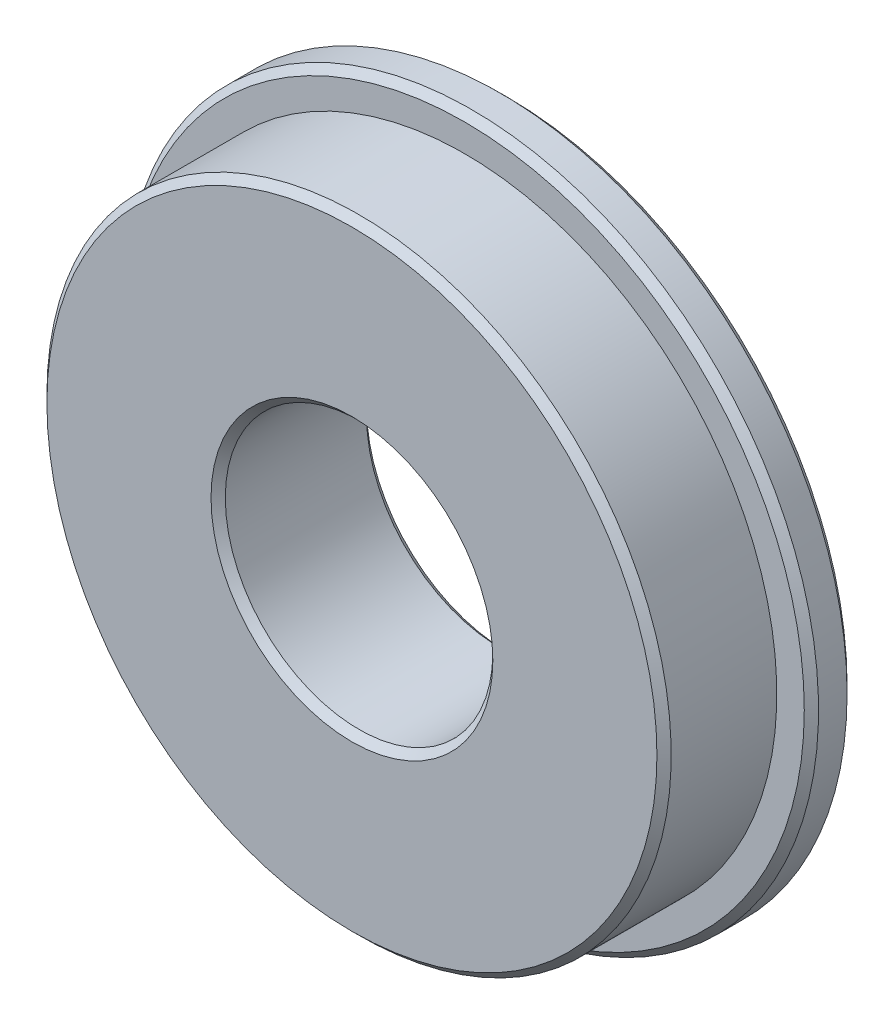
ISO-10303-21;
HEADER;
FILE_DESCRIPTION(('STEP AP214'),'2;1');
FILE_NAME('part.step','',(''),(''),'','','');
FILE_SCHEMA(('AUTOMOTIVE_DESIGN { 1 0 10303 214 1 1 1 1 }'));
ENDSEC;
DATA;
#1=APPLICATION_CONTEXT('core data for automotive mechanical design processes');
#2=APPLICATION_PROTOCOL_DEFINITION('international standard','automotive_design',2000,#1);
#3=PRODUCT_CONTEXT('',#1,'mechanical');
#4=PRODUCT('Part','Part','',(#3));
#5=PRODUCT_RELATED_PRODUCT_CATEGORY('part','',(#4));
#6=PRODUCT_DEFINITION_FORMATION('','',#4);
#7=PRODUCT_DEFINITION_CONTEXT('part definition',#1,'design');
#8=PRODUCT_DEFINITION('design','',#6,#7);
#9=PRODUCT_DEFINITION_SHAPE('','',#8);
#10=(LENGTH_UNIT() NAMED_UNIT(*) SI_UNIT(.MILLI.,.METRE.));
#11=(NAMED_UNIT(*) PLANE_ANGLE_UNIT() SI_UNIT($,.RADIAN.));
#12=(NAMED_UNIT(*) SI_UNIT($,.STERADIAN.) SOLID_ANGLE_UNIT());
#13=UNCERTAINTY_MEASURE_WITH_UNIT(LENGTH_MEASURE(1.E-05),#10,'distance_accuracy_value','');
#14=(GEOMETRIC_REPRESENTATION_CONTEXT(3) GLOBAL_UNCERTAINTY_ASSIGNED_CONTEXT((#13)) GLOBAL_UNIT_ASSIGNED_CONTEXT((#10,
#11,#12)) REPRESENTATION_CONTEXT('',''));
#15=CARTESIAN_POINT('',(0.,0.,0.));
#16=DIRECTION('',(0.,0.,1.));
#17=DIRECTION('',(1.,0.,0.));
#18=AXIS2_PLACEMENT_3D('',#15,#16,#17);
#19=CARTESIAN_POINT('',(-8.86153846153846,6.04195804195805,5.28319999999998));
#20=DIRECTION('',(0.,0.,-1.));
#21=DIRECTION('',(-1.,0.,0.));
#22=AXIS2_PLACEMENT_3D('',#19,#20,#21);
#23=CONICAL_SURFACE('',#22,11.1125,0.78539816339745);
#24=CARTESIAN_POINT('',(-8.86153846153846,6.04195804195805,5.2832));
#25=DIRECTION('',(0.,0.,-1.));
#26=DIRECTION('',(-1.,0.,0.));
#27=AXIS2_PLACEMENT_3D('',#24,#25,#26);
#28=CIRCLE('',#27,11.1125);
#29=CARTESIAN_POINT('',(-19.9740384615385,6.04195804195805,5.2832));
#30=VERTEX_POINT('',#29);
#31=EDGE_CURVE('E44',#30,#30,#28,.T.);
#32=ORIENTED_EDGE('',*,*,#31,.F.);
#33=EDGE_LOOP('',(#32));
#34=FACE_BOUND('',#33,.T.);
#35=CARTESIAN_POINT('',(-8.86153846153846,6.04195804195805,5.53719999999998));
#36=DIRECTION('',(0.,0.,-1.));
#37=DIRECTION('',(-1.,0.,0.));
#38=AXIS2_PLACEMENT_3D('',#35,#36,#37);
#39=CIRCLE('',#38,10.8585);
#40=CARTESIAN_POINT('',(-19.7200384615385,6.04195804195805,5.53719999999998));
#41=VERTEX_POINT('',#40);
#42=EDGE_CURVE('E18',#41,#41,#39,.T.);
#43=ORIENTED_EDGE('',*,*,#42,.T.);
#44=EDGE_LOOP('',(#43));
#45=FACE_BOUND('',#44,.T.);
#46=ADVANCED_FACE('F15',(#34,#45),#23,.T.);
#47=CARTESIAN_POINT('',(-8.86153846153846,6.04195804195805,5.5372));
#48=DIRECTION('',(0.,0.,-1.));
#49=DIRECTION('',(-1.,0.,0.));
#50=AXIS2_PLACEMENT_3D('',#47,#48,#49);
#51=CYLINDRICAL_SURFACE('',#50,11.1125);
#52=CARTESIAN_POINT('',(-8.86153846153846,6.04195804195805,1.524));
#53=DIRECTION('',(0.,0.,-1.));
#54=DIRECTION('',(-1.,0.,0.));
#55=AXIS2_PLACEMENT_3D('',#52,#53,#54);
#56=CIRCLE('',#55,11.1125);
#57=CARTESIAN_POINT('',(-19.9740384615385,6.04195804195805,1.524));
#58=VERTEX_POINT('',#57);
#59=EDGE_CURVE('E39',#58,#58,#56,.F.);
#60=ORIENTED_EDGE('',*,*,#59,.T.);
#61=EDGE_LOOP('',(#60));
#62=FACE_BOUND('',#61,.T.);
#63=ORIENTED_EDGE('',*,*,#31,.T.);
#64=EDGE_LOOP('',(#63));
#65=FACE_BOUND('',#64,.T.);
#66=ADVANCED_FACE('F159',(#62,#65),#51,.T.);
#67=CARTESIAN_POINT('',(-8.86153846153846,6.04195804195805,5.5372));
#68=DIRECTION('',(0.,0.,-1.));
#69=DIRECTION('',(-1.,0.,0.));
#70=AXIS2_PLACEMENT_3D('',#67,#68,#69);
#71=PLANE('',#70);
#72=ORIENTED_EDGE('',*,*,#42,.F.);
#73=EDGE_LOOP('',(#72));
#74=FACE_BOUND('',#73,.T.);
#75=CARTESIAN_POINT('',(-8.86153846153846,6.04195804195805,5.53719999993518));
#76=DIRECTION('',(0.,0.,1.));
#77=DIRECTION('',(1.,0.,0.));
#78=AXIS2_PLACEMENT_3D('',#75,#76,#77);
#79=CIRCLE('',#78,5.01650000001817);
#80=CARTESIAN_POINT('',(-3.84503846152029,6.04195804195805,5.53719999993518));
#81=VERTEX_POINT('',#80);
#82=EDGE_CURVE('E37',#81,#81,#79,.F.);
#83=ORIENTED_EDGE('',*,*,#82,.T.);
#84=EDGE_LOOP('',(#83));
#85=FACE_BOUND('',#84,.T.);
#86=ADVANCED_FACE('F149',(#74,#85),#71,.F.);
#87=CARTESIAN_POINT('',(-8.86153846153846,6.04195804195805,1.524));
#88=DIRECTION('',(0.,0.,-1.));
#89=DIRECTION('',(-1.,0.,0.));
#90=AXIS2_PLACEMENT_3D('',#87,#88,#89);
#91=PLANE('',#90);
#92=ORIENTED_EDGE('',*,*,#59,.F.);
#93=EDGE_LOOP('',(#92));
#94=FACE_BOUND('',#93,.T.);
#95=CARTESIAN_POINT('',(-8.86153846153846,6.04195804195805,1.52399999999998));
#96=DIRECTION('',(0.,0.,-1.));
#97=DIRECTION('',(-1.,0.,0.));
#98=AXIS2_PLACEMENT_3D('',#95,#96,#97);
#99=CIRCLE('',#98,12.0904);
#100=CARTESIAN_POINT('',(-20.9519384615385,6.04195804195805,1.52399999999998));
#101=VERTEX_POINT('',#100);
#102=EDGE_CURVE('E33',#101,#101,#99,.T.);
#103=ORIENTED_EDGE('',*,*,#102,.F.);
#104=EDGE_LOOP('',(#103));
#105=FACE_BOUND('',#104,.T.);
#106=ADVANCED_FACE('F139',(#94,#105),#91,.F.);
#107=CARTESIAN_POINT('',(-8.86153846153846,6.04195804195805,5.53719999993518));
#108=DIRECTION('',(0.,0.,1.));
#109=DIRECTION('',(1.,0.,0.));
#110=AXIS2_PLACEMENT_3D('',#107,#108,#109);
#111=CONICAL_SURFACE('',#110,5.01650000001817,0.785398163397448);
#112=ORIENTED_EDGE('',*,*,#82,.F.);
#113=EDGE_LOOP('',(#112));
#114=FACE_BOUND('',#113,.T.);
#115=CARTESIAN_POINT('',(-8.86153846153846,6.04195804195805,5.2832));
#116=DIRECTION('',(0.,0.,-1.));
#117=DIRECTION('',(-1.,0.,0.));
#118=AXIS2_PLACEMENT_3D('',#115,#116,#117);
#119=CIRCLE('',#118,4.7625);
#120=CARTESIAN_POINT('',(-13.6240384615385,6.04195804195805,5.2832));
#121=VERTEX_POINT('',#120);
#122=EDGE_CURVE('E36',#121,#121,#119,.T.);
#123=ORIENTED_EDGE('',*,*,#122,.T.);
#124=EDGE_LOOP('',(#123));
#125=FACE_BOUND('',#124,.T.);
#126=ADVANCED_FACE('F129',(#114,#125),#111,.F.);
#127=CARTESIAN_POINT('',(-8.86153846153846,6.04195804195805,1.26999999999998));
#128=DIRECTION('',(0.,0.,-1.));
#129=DIRECTION('',(-1.,0.,0.));
#130=AXIS2_PLACEMENT_3D('',#127,#128,#129);
#131=CONICAL_SURFACE('',#130,12.3444,0.785398163397451);
#132=CARTESIAN_POINT('',(-8.86153846153846,6.04195804195805,1.27));
#133=DIRECTION('',(0.,0.,-1.));
#134=DIRECTION('',(-1.,0.,0.));
#135=AXIS2_PLACEMENT_3D('',#132,#133,#134);
#136=CIRCLE('',#135,12.3444);
#137=CARTESIAN_POINT('',(-21.2059384615385,6.04195804195805,1.27));
#138=VERTEX_POINT('',#137);
#139=EDGE_CURVE('E55',#138,#138,#136,.T.);
#140=ORIENTED_EDGE('',*,*,#139,.F.);
#141=EDGE_LOOP('',(#140));
#142=FACE_BOUND('',#141,.T.);
#143=ORIENTED_EDGE('',*,*,#102,.T.);
#144=EDGE_LOOP('',(#143));
#145=FACE_BOUND('',#144,.T.);
#146=ADVANCED_FACE('F85',(#142,#145),#131,.T.);
#147=CARTESIAN_POINT('',(-8.86153846153846,6.04195804195805,1.524));
#148=DIRECTION('',(0.,0.,-1.));
#149=DIRECTION('',(-1.,0.,0.));
#150=AXIS2_PLACEMENT_3D('',#147,#148,#149);
#151=CYLINDRICAL_SURFACE('',#150,4.7625);
#152=ORIENTED_EDGE('',*,*,#122,.F.);
#153=EDGE_LOOP('',(#152));
#154=FACE_BOUND('',#153,.T.);
#155=CARTESIAN_POINT('',(-8.86153846153846,6.04195804195805,0.253999999927146));
#156=DIRECTION('',(0.,0.,-1.));
#157=DIRECTION('',(-1.,0.,0.));
#158=AXIS2_PLACEMENT_3D('',#155,#156,#157);
#159=CIRCLE('',#158,4.76249999996227);
#160=CARTESIAN_POINT('',(-13.6240384615007,6.04195804195805,0.253999999927146));
#161=VERTEX_POINT('',#160);
#162=EDGE_CURVE('E60',#161,#161,#159,.T.);
#163=ORIENTED_EDGE('',*,*,#162,.T.);
#164=EDGE_LOOP('',(#163));
#165=FACE_BOUND('',#164,.T.);
#166=ADVANCED_FACE('F75',(#154,#165),#151,.F.);
#167=CARTESIAN_POINT('',(-8.86153846153846,6.04195804195805,1.524));
#168=DIRECTION('',(0.,0.,-1.));
#169=DIRECTION('',(-1.,0.,0.));
#170=AXIS2_PLACEMENT_3D('',#167,#168,#169);
#171=CYLINDRICAL_SURFACE('',#170,12.3444);
#172=ORIENTED_EDGE('',*,*,#139,.T.);
#173=EDGE_LOOP('',(#172));
#174=FACE_BOUND('',#173,.T.);
#175=CARTESIAN_POINT('',(-8.86153846153846,6.04195804195805,0.25400000000002));
#176=DIRECTION('',(0.,0.,1.));
#177=DIRECTION('',(1.,0.,0.));
#178=AXIS2_PLACEMENT_3D('',#175,#176,#177);
#179=CIRCLE('',#178,12.3444);
#180=CARTESIAN_POINT('',(3.48286153846156,6.04195804195805,0.25400000000002));
#181=VERTEX_POINT('',#180);
#182=EDGE_CURVE('E27',#181,#181,#179,.F.);
#183=ORIENTED_EDGE('',*,*,#182,.F.);
#184=EDGE_LOOP('',(#183));
#185=FACE_BOUND('',#184,.T.);
#186=ADVANCED_FACE('F72',(#174,#185),#171,.T.);
#187=CARTESIAN_POINT('',(-8.86153846153846,6.04195804195805,-1.13686837721616E-10));
#188=DIRECTION('',(0.,0.,-1.));
#189=DIRECTION('',(-1.,0.,0.));
#190=AXIS2_PLACEMENT_3D('',#187,#188,#189);
#191=CONICAL_SURFACE('',#190,5.01650000005995,0.785398163397448);
#192=ORIENTED_EDGE('',*,*,#162,.F.);
#193=EDGE_LOOP('',(#192));
#194=FACE_BOUND('',#193,.T.);
#195=CARTESIAN_POINT('',(-8.86153846153846,6.04195804195805,-5.6843418860808E-11));
#196=DIRECTION('',(0.,0.,-1.));
#197=DIRECTION('',(-1.,0.,0.));
#198=AXIS2_PLACEMENT_3D('',#195,#196,#197);
#199=CIRCLE('',#198,5.0165000000031);
#200=CARTESIAN_POINT('',(-13.8780384615416,6.04195804195805,-5.6843418860808E-11));
#201=VERTEX_POINT('',#200);
#202=EDGE_CURVE('E22',#201,#201,#199,.F.);
#203=ORIENTED_EDGE('',*,*,#202,.F.);
#204=EDGE_LOOP('',(#203));
#205=FACE_BOUND('',#204,.T.);
#206=ADVANCED_FACE('F74',(#194,#205),#191,.F.);
#207=CARTESIAN_POINT('',(-8.86153846153846,6.04195804195805,0.254000000000021));
#208=DIRECTION('',(0.,0.,1.));
#209=DIRECTION('',(1.,0.,0.));
#210=AXIS2_PLACEMENT_3D('',#207,#208,#209);
#211=CONICAL_SURFACE('',#210,12.3444,0.785398163397449);
#212=CARTESIAN_POINT('',(-8.86153846153846,6.04195804195805,0.));
#213=DIRECTION('',(0.,0.,1.));
#214=DIRECTION('',(1.,0.,0.));
#215=AXIS2_PLACEMENT_3D('',#212,#213,#214);
#216=CIRCLE('',#215,12.0904);
#217=CARTESIAN_POINT('',(3.22886153846156,6.04195804195805,0.));
#218=VERTEX_POINT('',#217);
#219=EDGE_CURVE('E10',#218,#218,#216,.F.);
#220=ORIENTED_EDGE('',*,*,#219,.F.);
#221=EDGE_LOOP('',(#220));
#222=FACE_BOUND('',#221,.T.);
#223=ORIENTED_EDGE('',*,*,#182,.T.);
#224=EDGE_LOOP('',(#223));
#225=FACE_BOUND('',#224,.T.);
#226=ADVANCED_FACE('F70',(#222,#225),#211,.T.);
#227=CARTESIAN_POINT('',(-8.86153846153846,6.04195804195805,0.));
#228=DIRECTION('',(0.,0.,-1.));
#229=DIRECTION('',(-1.,0.,0.));
#230=AXIS2_PLACEMENT_3D('',#227,#228,#229);
#231=PLANE('',#230);
#232=ORIENTED_EDGE('',*,*,#219,.T.);
#233=EDGE_LOOP('',(#232));
#234=FACE_BOUND('',#233,.T.);
#235=ORIENTED_EDGE('',*,*,#202,.T.);
#236=EDGE_LOOP('',(#235));
#237=FACE_BOUND('',#236,.T.);
#238=ADVANCED_FACE('F88',(#234,#237),#231,.T.);
#239=CLOSED_SHELL('',(#46,#66,#86,#106,#126,#146,#166,#186,#206,#226,#238));
#240=MANIFOLD_SOLID_BREP('B1',#239);
#241=ADVANCED_BREP_SHAPE_REPRESENTATION('',(#18,#240),#14);
#242=SHAPE_DEFINITION_REPRESENTATION(#9,#241);
ENDSEC;
END-ISO-10303-21;
